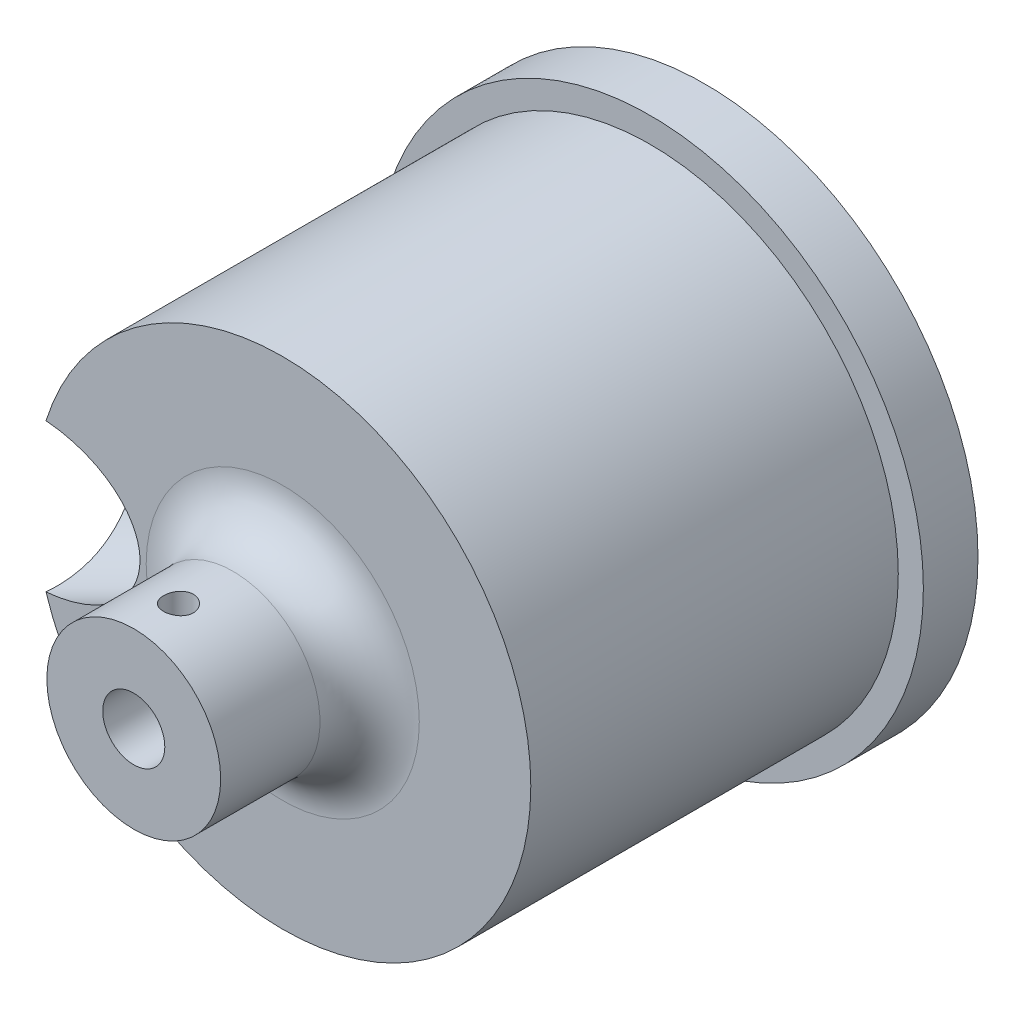
ISO-10303-21;
HEADER;
FILE_DESCRIPTION(('STEP AP214'),'2;1');
FILE_NAME('part.step','',(''),(''),'','','');
FILE_SCHEMA(('AUTOMOTIVE_DESIGN { 1 0 10303 214 1 1 1 1 }'));
ENDSEC;
DATA;
#1=APPLICATION_CONTEXT('core data for automotive mechanical design processes');
#2=APPLICATION_PROTOCOL_DEFINITION('international standard','automotive_design',2000,#1);
#3=PRODUCT_CONTEXT('',#1,'mechanical');
#4=PRODUCT('Part','Part','',(#3));
#5=PRODUCT_RELATED_PRODUCT_CATEGORY('part','',(#4));
#6=PRODUCT_DEFINITION_FORMATION('','',#4);
#7=PRODUCT_DEFINITION_CONTEXT('part definition',#1,'design');
#8=PRODUCT_DEFINITION('design','',#6,#7);
#9=PRODUCT_DEFINITION_SHAPE('','',#8);
#10=(LENGTH_UNIT() NAMED_UNIT(*) SI_UNIT(.MILLI.,.METRE.));
#11=(NAMED_UNIT(*) PLANE_ANGLE_UNIT() SI_UNIT($,.RADIAN.));
#12=(NAMED_UNIT(*) SI_UNIT($,.STERADIAN.) SOLID_ANGLE_UNIT());
#13=UNCERTAINTY_MEASURE_WITH_UNIT(LENGTH_MEASURE(1.E-05),#10,'distance_accuracy_value','');
#14=(GEOMETRIC_REPRESENTATION_CONTEXT(3) GLOBAL_UNCERTAINTY_ASSIGNED_CONTEXT((#13)) GLOBAL_UNIT_ASSIGNED_CONTEXT((#10,
#11,#12)) REPRESENTATION_CONTEXT('',''));
#15=CARTESIAN_POINT('',(0.,0.,0.));
#16=DIRECTION('',(0.,0.,1.));
#17=DIRECTION('',(1.,0.,0.));
#18=AXIS2_PLACEMENT_3D('',#15,#16,#17);
#19=CARTESIAN_POINT('',(0.,0.,25.));
#20=DIRECTION('',(0.,0.,1.));
#21=DIRECTION('',(1.,0.,0.));
#22=AXIS2_PLACEMENT_3D('',#19,#20,#21);
#23=CYLINDRICAL_SURFACE('',#22,24.975);
#24=CARTESIAN_POINT('',(0.,0.,-12.));
#25=DIRECTION('',(0.,0.,1.));
#26=DIRECTION('',(1.,0.,0.));
#27=AXIS2_PLACEMENT_3D('',#24,#25,#26);
#28=CIRCLE('',#27,24.975);
#29=CARTESIAN_POINT('',(24.975,0.,-12.));
#30=VERTEX_POINT('',#29);
#31=EDGE_CURVE('E123',#30,#30,#28,.T.);
#32=ORIENTED_EDGE('',*,*,#31,.T.);
#33=EDGE_LOOP('',(#32));
#34=FACE_BOUND('',#33,.T.);
#35=CARTESIAN_POINT('',(-23.8358983547869,7.45657928411341,25.));
#36=CARTESIAN_POINT('',(-23.8285639101941,7.47993592051796,24.6863459241653));
#37=CARTESIAN_POINT('',(-23.8241161903903,7.49411556448452,24.371855087137));
#38=CARTESIAN_POINT('',(-23.8213557793412,7.50293419891314,23.7422316009251));
#39=CARTESIAN_POINT('',(-23.8230500025732,7.49755116608571,23.4270986278052));
#40=CARTESIAN_POINT('',(-23.8329996120545,7.4658519739387,22.7949879497982));
#41=CARTESIAN_POINT('',(-23.8413163209704,7.43934016516037,22.4780206233164));
#42=CARTESIAN_POINT('',(-23.8648120391557,7.36362632386387,21.847140533864));
#43=CARTESIAN_POINT('',(-23.8799881932151,7.3144337319382,21.5332265554326));
#44=CARTESIAN_POINT('',(-23.9143887352912,7.2010801097362,20.9581903121674));
#45=CARTESIAN_POINT('',(-23.9326398160095,7.14035620245514,20.6963327074498));
#46=CARTESIAN_POINT('',(-23.9739576788844,7.00037986247415,20.1780130230676));
#47=CARTESIAN_POINT('',(-23.9970235507857,6.92113093166448,19.9215499336222));
#48=CARTESIAN_POINT('',(-24.0475809044411,6.74336623567378,19.4167361394446));
#49=CARTESIAN_POINT('',(-24.0750579517138,6.6449130929803,19.1683620498677));
#50=CARTESIAN_POINT('',(-24.1339582061038,6.42770183660886,18.6811328554532));
#51=CARTESIAN_POINT('',(-24.1653806365416,6.30894771767831,18.4422758892534));
#52=CARTESIAN_POINT('',(-24.2256249433421,6.07304043267515,18.017207342297));
#53=CARTESIAN_POINT('',(-24.253945712199,5.95921486276715,17.8290753654634));
#54=CARTESIAN_POINT('',(-24.3121456413984,5.71714033236125,17.4626036158131));
#55=CARTESIAN_POINT('',(-24.3420244747637,5.58889439165799,17.2842618044196));
#56=CARTESIAN_POINT('',(-24.4026473021022,5.31796002935831,16.9389099305144));
#57=CARTESIAN_POINT('',(-24.4333916636761,5.17526540232323,16.7719047887639));
#58=CARTESIAN_POINT('',(-24.4949081658501,4.87580298837125,16.4509960088916));
#59=CARTESIAN_POINT('',(-24.525680306823,4.71903500978308,16.2970925492631));
#60=CARTESIAN_POINT('',(-24.5865409451059,4.39097183736243,16.0030921377799));
#61=CARTESIAN_POINT('',(-24.6166235430746,4.21958705801949,15.8630936933448));
#62=CARTESIAN_POINT('',(-24.6749112742764,3.86416796985566,15.5997061886447));
#63=CARTESIAN_POINT('',(-24.7031163600608,3.68013334158497,15.4763175480642));
#64=CARTESIAN_POINT('',(-24.7566550893783,3.30080557692901,15.2477017748731));
#65=CARTESIAN_POINT('',(-24.7819899302333,3.10551718671868,15.1424670597105));
#66=CARTESIAN_POINT('',(-24.8288725175023,2.70523381480103,14.9514161784731));
#67=CARTESIAN_POINT('',(-24.8504207667142,2.50024012639561,14.8655974338366));
#68=CARTESIAN_POINT('',(-24.8866140731468,2.10741537402225,14.7234882034024));
#69=CARTESIAN_POINT('',(-24.9017764062389,1.92046180607324,14.6648943012555));
#70=CARTESIAN_POINT('',(-24.9280797353109,1.54189821500481,14.5641565951097));
#71=CARTESIAN_POINT('',(-24.9392210029606,1.3502885073957,14.5220116797747));
#72=CARTESIAN_POINT('',(-24.9571376570087,0.963991615634853,14.4545969817739));
#73=CARTESIAN_POINT('',(-24.9639145783132,0.769305538124754,14.4293212662305));
#74=CARTESIAN_POINT('',(-24.9728990279623,0.378364646440848,14.3958689950458));
#75=CARTESIAN_POINT('',(-24.9751066797569,0.182109874792935,14.3876919774418));
#76=CARTESIAN_POINT('',(-24.9748920757942,-0.198401907564117,14.3884892990043));
#77=CARTESIAN_POINT('',(-24.9727434722412,-0.382662041545914,14.3964498972913));
#78=CARTESIAN_POINT('',(-24.9644169839608,-0.749815583739789,14.4274489981027));
#79=CARTESIAN_POINT('',(-24.9582391957625,-0.93270902458826,14.4504871394068));
#80=CARTESIAN_POINT('',(-24.9420241681087,-1.29579186716461,14.5114369388456));
#81=CARTESIAN_POINT('',(-24.9319875782319,-1.47598171870466,14.5493460936621));
#82=CARTESIAN_POINT('',(-24.90832623208,-1.83243471363894,14.6397102905865));
#83=CARTESIAN_POINT('',(-24.8947014302312,-2.00869780712871,14.692165517444));
#84=CARTESIAN_POINT('',(-24.8642674571147,-2.35564812985435,14.8110096401886));
#85=CARTESIAN_POINT('',(-24.8474668209859,-2.52634889857689,14.8773612396466));
#86=CARTESIAN_POINT('',(-24.8110884487831,-2.86163667363689,15.0235362175563));
#87=CARTESIAN_POINT('',(-24.7915097848453,-3.02622161401121,15.103364098796));
#88=CARTESIAN_POINT('',(-24.7500780302153,-3.34822556638973,15.2757839515636));
#89=CARTESIAN_POINT('',(-24.7282252727208,-3.50564562334024,15.3683740538281));
#90=CARTESIAN_POINT('',(-24.682774952434,-3.81252059188369,15.5655572646166));
#91=CARTESIAN_POINT('',(-24.6591772460386,-3.96197484617389,15.6701513614186));
#92=CARTESIAN_POINT('',(-24.6096685435564,-4.25893637318294,15.8955853683931));
#93=CARTESIAN_POINT('',(-24.5837010301654,-4.40603334327311,16.0169531483653));
#94=CARTESIAN_POINT('',(-24.5310866221783,-4.69012704819304,16.2708413293745));
#95=CARTESIAN_POINT('',(-24.504439694426,-4.82712328882173,16.403362275427));
#96=CARTESIAN_POINT('',(-24.4510682092883,-5.09057532975486,16.6784566764885));
#97=CARTESIAN_POINT('',(-24.4243436552204,-5.21703157383801,16.8210297077949));
#98=CARTESIAN_POINT('',(-24.3713603066347,-5.45919317422267,17.1151714687879));
#99=CARTESIAN_POINT('',(-24.3451016741666,-5.57489484712435,17.2667432515989));
#100=CARTESIAN_POINT('',(-24.2907254663228,-5.80750281465228,17.5948201113112));
#101=CARTESIAN_POINT('',(-24.2627196613049,-5.9231507657677,17.7722369862976));
#102=CARTESIAN_POINT('',(-24.2084633953026,-6.14113176830489,18.1353557677134));
#103=CARTESIAN_POINT('',(-24.1822136451023,-6.24345944384757,18.3210609788479));
#104=CARTESIAN_POINT('',(-24.1068133997002,-6.53083329810495,18.8887324853685));
#105=CARTESIAN_POINT('',(-24.0610104636441,-6.69627626171184,19.2812632107549));
#106=CARTESIAN_POINT('',(-23.9903902216864,-6.94435209219805,19.9888821635995));
#107=CARTESIAN_POINT('',(-23.9631721757241,-7.03731907123234,20.300254122345));
#108=CARTESIAN_POINT('',(-23.9158398438599,-7.19653873585202,20.9304586114811));
#109=CARTESIAN_POINT('',(-23.8957291577586,-7.26277788648277,21.2492948355246));
#110=CARTESIAN_POINT('',(-23.8627603288276,-7.37037563179602,21.8918738388647));
#111=CARTESIAN_POINT('',(-23.8499121129571,-7.41170017619662,22.215622715893));
#112=CARTESIAN_POINT('',(-23.8313755661034,-7.47108535899488,22.8652993111449));
#113=CARTESIAN_POINT('',(-23.8256845119082,-7.48915484571742,23.1912261531974));
#114=CARTESIAN_POINT('',(-23.8216863249888,-7.5018609925442,23.7651653499253));
#115=CARTESIAN_POINT('',(-23.8219337105424,-7.5010843621143,24.0130844371245));
#116=CARTESIAN_POINT('',(-23.8261752232384,-7.48758522697046,24.5074934988594));
#117=CARTESIAN_POINT('',(-23.8301530961375,-7.47491454603172,24.753985008211));
#118=CARTESIAN_POINT('',(-23.8358983547869,-7.45657928411341,25.));
#119=B_SPLINE_CURVE_WITH_KNOTS('',3,(#35,#36,#37,#38,#39,#40,#41,#42,#43,#44,#45,#46,#47,#48,
#49,#50,#51,#52,#53,#54,#55,#56,#57,#58,#59,#60,#61,#62,#63,#64,#65,#66,#67,#68,#69,#70,#71,#72,
#73,#74,#75,#76,#77,#78,#79,#80,#81,#82,#83,#84,#85,#86,#87,#88,#89,#90,#91,#92,#93,#94,#95,#96,
#97,#98,#99,#100,#101,#102,#103,#104,#105,#106,#107,#108,#109,#110,#111,#112,#113,#114,#115,
#116,#117,#118),.UNSPECIFIED.,.F.,.F.,(4,2,2,2,2,2,2,2,2,2,2,2,2,2,2,2,2,2,2,2,2,2,2,2,2,2,2,2,
2,2,2,2,2,2,2,2,2,2,2,2,2,4),(0.,0.943803809705601,1.88867046476951,2.84238955327144,
3.79571202600659,4.60332218835892,5.41077980686455,6.21564714578679,7.02035628795754,
7.68482820730673,8.34916123668904,9.01378080463056,9.67840942569701,10.3474531375278,
11.0165137510985,11.6852942304824,12.3539858394517,12.9427463589016,13.5314670932796,
14.1199806660084,14.7084783384084,15.2611528852577,15.8138141918878,16.3663825059424,
16.9189578384865,17.470068697116,18.0213640624802,18.5725787660748,19.1238388832717,
19.7006144436607,20.2774182053993,20.8541976689645,21.4311739549742,22.0713998107501,
22.711883256981,23.9928188571407,24.9699124903306,25.947500303983,26.9264211560037,
27.9049694278673,28.6484251411223,29.3886564925264),.UNSPECIFIED.);
#120=CARTESIAN_POINT('',(-23.8358983547869,7.45657928411342,25.));
#121=VERTEX_POINT('',#120);
#122=CARTESIAN_POINT('',(-23.8358983547869,-7.45657928411341,25.));
#123=VERTEX_POINT('',#122);
#124=EDGE_CURVE('E113',#121,#123,#119,.T.);
#125=ORIENTED_EDGE('',*,*,#124,.F.);
#126=CARTESIAN_POINT('',(0.,0.,25.));
#127=DIRECTION('',(0.,0.,1.));
#128=DIRECTION('',(1.,0.,0.));
#129=AXIS2_PLACEMENT_3D('',#126,#127,#128);
#130=CIRCLE('',#129,24.975);
#131=EDGE_CURVE('E125',#123,#121,#130,.T.);
#132=ORIENTED_EDGE('',*,*,#131,.F.);
#133=EDGE_LOOP('',(#125,#132));
#134=FACE_BOUND('',#133,.T.);
#135=ADVANCED_FACE('F41',(#34,#134),#23,.T.);
#136=CARTESIAN_POINT('',(-24.975,0.,25.));
#137=DIRECTION('',(0.,0.,-1.));
#138=DIRECTION('',(-1.,0.,0.));
#139=AXIS2_PLACEMENT_3D('',#136,#137,#138);
#140=PLANE('',#139);
#141=CARTESIAN_POINT('',(0.,0.,25.));
#142=DIRECTION('',(0.,0.,-1.));
#143=DIRECTION('',(-1.,0.,0.));
#144=AXIS2_PLACEMENT_3D('',#141,#142,#143);
#145=CIRCLE('',#144,13.75);
#146=CARTESIAN_POINT('',(-13.75,0.,25.));
#147=VERTEX_POINT('',#146);
#148=EDGE_CURVE('E49',#147,#147,#145,.T.);
#149=ORIENTED_EDGE('',*,*,#148,.T.);
#150=EDGE_LOOP('',(#149));
#151=FACE_BOUND('',#150,.T.);
#152=ORIENTED_EDGE('',*,*,#131,.T.);
#153=CARTESIAN_POINT('',(-24.975,0.,25.));
#154=DIRECTION('',(0.,0.,-1.));
#155=DIRECTION('',(-1.,0.,0.));
#156=AXIS2_PLACEMENT_3D('',#153,#154,#155);
#157=ELLIPSE('',#156,10.6012997434277,7.5);
#158=EDGE_CURVE('E57',#121,#123,#157,.T.);
#159=ORIENTED_EDGE('',*,*,#158,.T.);
#160=EDGE_LOOP('',(#152,#159));
#161=FACE_BOUND('',#160,.T.);
#162=ADVANCED_FACE('F122',(#151,#161),#140,.F.);
#163=CARTESIAN_POINT('',(0.,0.,45.));
#164=DIRECTION('',(0.,0.,-1.));
#165=DIRECTION('',(-1.,0.,0.));
#166=AXIS2_PLACEMENT_3D('',#163,#164,#165);
#167=CYLINDRICAL_SURFACE('',#166,8.75);
#168=CARTESIAN_POINT('',(0.,8.75,34.));
#169=CARTESIAN_POINT('',(-0.0835989442386164,8.74999854533168,34.0000033199861));
#170=CARTESIAN_POINT('',(-0.167242629071561,8.74878946707916,34.0070123945573));
#171=CARTESIAN_POINT('',(-0.332181627885485,8.74408266539355,34.0348504502178));
#172=CARTESIAN_POINT('',(-0.413474751921135,8.74058287523621,34.0556919113898));
#173=CARTESIAN_POINT('',(-0.571302645066654,8.73168696812766,34.1105449569762));
#174=CARTESIAN_POINT('',(-0.647841333712987,8.72629243827974,34.1445455212658));
#175=CARTESIAN_POINT('',(-0.794118368623576,8.71419930408208,34.2247222201168));
#176=CARTESIAN_POINT('',(-0.863857441399455,8.70750083928223,34.2708970519495));
#177=CARTESIAN_POINT('',(-0.995268439907604,8.69346612902714,34.3746069264191));
#178=CARTESIAN_POINT('',(-1.0568618079566,8.68612466923957,34.4322408145647));
#179=CARTESIAN_POINT('',(-1.16955417441213,8.67167103987754,34.5570200493148));
#180=CARTESIAN_POINT('',(-1.22065249123587,8.66455888522017,34.6241660131862));
#181=CARTESIAN_POINT('',(-1.31122171713836,8.65131860287636,34.7666064446881));
#182=CARTESIAN_POINT('',(-1.35061445216314,8.6451972101288,34.8419512992188));
#183=CARTESIAN_POINT('',(-1.41615427557975,8.63470414423137,34.9983113135358));
#184=CARTESIAN_POINT('',(-1.44230231211954,8.63033234583804,35.0793260669586));
#185=CARTESIAN_POINT('',(-1.48036195780661,8.62388550159562,35.2438916582515));
#186=CARTESIAN_POINT('',(-1.49240950237182,8.62178853987851,35.3274101829207));
#187=CARTESIAN_POINT('',(-1.50234775058279,8.62006255030295,35.4953075674591));
#188=CARTESIAN_POINT('',(-1.50023951416803,8.62043333766735,35.5796863624417));
#189=CARTESIAN_POINT('',(-1.48203665985519,8.62358095436352,35.7459355699223));
#190=CARTESIAN_POINT('',(-1.46609515128517,8.62633144371434,35.8278233180893));
#191=CARTESIAN_POINT('',(-1.42091873893297,8.63388729213218,35.987744458214));
#192=CARTESIAN_POINT('',(-1.39168335518909,8.63869272539048,36.0657777108965));
#193=CARTESIAN_POINT('',(-1.32059505534932,8.64984526339615,36.2162308716234));
#194=CARTESIAN_POINT('',(-1.27867894551892,8.65620005778534,36.2886203275124));
#195=CARTESIAN_POINT('',(-1.18346386577856,8.66973001190969,36.4253962351229));
#196=CARTESIAN_POINT('',(-1.13016392519266,8.67690524157741,36.4897820036452));
#197=CARTESIAN_POINT('',(-1.01286186149799,8.6913831271253,36.6096087779754));
#198=CARTESIAN_POINT('',(-0.948728459636025,8.69868621946603,36.664921298771));
#199=CARTESIAN_POINT('',(-0.812022942479687,8.71251002037548,36.7640197256158));
#200=CARTESIAN_POINT('',(-0.739450766808481,8.71903072334576,36.8078055491879));
#201=CARTESIAN_POINT('',(-0.587804067019338,8.73056510572575,36.8826209245452));
#202=CARTESIAN_POINT('',(-0.508723613881951,8.73557739117882,36.9136386868029));
#203=CARTESIAN_POINT('',(-0.346370422397847,8.74351910124272,36.9619159013384));
#204=CARTESIAN_POINT('',(-0.263098056044994,8.7464487103243,36.9791765721519));
#205=CARTESIAN_POINT('',(-0.0958318104733762,8.74987005836954,36.9992744424493));
#206=CARTESIAN_POINT('',(-0.0118597040843769,8.75039159522844,37.0022879499979));
#207=CARTESIAN_POINT('',(0.155389295281614,8.7490198022012,36.9942766257273));
#208=CARTESIAN_POINT('',(0.238666216475369,8.74712657081211,36.9832523665009));
#209=CARTESIAN_POINT('',(0.401613133905656,8.74115643713808,36.9476250839372));
#210=CARTESIAN_POINT('',(0.481302868720163,8.73709364466652,36.923109769029));
#211=CARTESIAN_POINT('',(0.635441265489672,8.72723807861037,36.8612900835129));
#212=CARTESIAN_POINT('',(0.709889618818364,8.72144520325905,36.8239849605654));
#213=CARTESIAN_POINT('',(0.85219484645228,8.70869801707149,36.7372437915629));
#214=CARTESIAN_POINT('',(0.919983968910232,8.70173340431864,36.6876981371588));
#215=CARTESIAN_POINT('',(1.04634876320204,8.68744528791298,36.5780325588378));
#216=CARTESIAN_POINT('',(1.10492372382458,8.68012175661356,36.5179118194222));
#217=CARTESIAN_POINT('',(1.21185461459522,8.66584430603362,36.3880102557164));
#218=CARTESIAN_POINT('',(1.26009115203268,8.65889533382755,36.3181305206007));
#219=CARTESIAN_POINT('',(1.34414088597865,8.64624770224082,36.171156386697));
#220=CARTESIAN_POINT('',(1.37995449248233,8.64054900159961,36.0940622261139));
#221=CARTESIAN_POINT('',(1.43796519533105,8.6310846384818,35.9351747598522));
#222=CARTESIAN_POINT('',(1.4602206875589,8.62731069752545,35.8534032904109));
#223=CARTESIAN_POINT('',(1.49066643655289,8.62210277652897,35.6872122670962));
#224=CARTESIAN_POINT('',(1.49885799429605,8.62066858005259,35.6027929588954));
#225=CARTESIAN_POINT('',(1.50090546278888,8.62031222810043,35.4348955943054));
#226=CARTESIAN_POINT('',(1.49494938196749,8.62135712762261,35.3514198413397));
#227=CARTESIAN_POINT('',(1.46927829070829,8.62576884510981,35.1866772418621));
#228=CARTESIAN_POINT('',(1.44956333247983,8.62913565426412,35.1054103869697));
#229=CARTESIAN_POINT('',(1.39700777718865,8.63779901677269,34.9474713907458));
#230=CARTESIAN_POINT('',(1.36418428469469,8.64309305460445,34.870793410993));
#231=CARTESIAN_POINT('',(1.28636295869389,8.65501664902595,34.7240022228427));
#232=CARTESIAN_POINT('',(1.2413644642831,8.66164627811152,34.6538893711027));
#233=CARTESIAN_POINT('',(1.13980326427207,8.67559803791655,34.5212705448671));
#234=CARTESIAN_POINT('',(1.08310255631921,8.68292781327498,34.4588710427187));
#235=CARTESIAN_POINT('',(0.960036856193801,8.69739385628585,34.3444083694159));
#236=CARTESIAN_POINT('',(0.893669640127244,8.70453007895987,34.2923475833366));
#237=CARTESIAN_POINT('',(0.752573839186562,8.71786592759124,34.1996885389346));
#238=CARTESIAN_POINT('',(0.677787383299676,8.72405828400737,34.1591773431));
#239=CARTESIAN_POINT('',(0.522393433887055,8.73473795330271,34.0913561581987));
#240=CARTESIAN_POINT('',(0.441791756510339,8.73922694244046,34.0640331835557));
#241=CARTESIAN_POINT('',(0.300743965339884,8.74502844510869,34.0292115664517));
#242=CARTESIAN_POINT('',(0.241145248405084,8.74688269150056,34.0182750255541));
#243=CARTESIAN_POINT('',(0.121038828280111,8.74936898406435,34.0036681088703));
#244=CARTESIAN_POINT('',(0.060531142246696,8.75000105327569,33.9999975961114));
#245=CARTESIAN_POINT('',(0.,8.75,34.));
#246=B_SPLINE_CURVE_WITH_KNOTS('',3,(#168,#169,#170,#171,#172,#173,#174,#175,#176,#177,#178,
#179,#180,#181,#182,#183,#184,#185,#186,#187,#188,#189,#190,#191,#192,#193,#194,#195,#196,#197,
#198,#199,#200,#201,#202,#203,#204,#205,#206,#207,#208,#209,#210,#211,#212,#213,#214,#215,#216,
#217,#218,#219,#220,#221,#222,#223,#224,#225,#226,#227,#228,#229,#230,#231,#232,#233,#234,#235,
#236,#237,#238,#239,#240,#241,#242,#243,#244,#245),.UNSPECIFIED.,.T.,.F.,(4,2,2,2,2,2,2,2,2,2,2,
2,2,2,2,2,2,2,2,2,2,2,2,2,2,2,2,2,2,2,2,2,2,2,2,2,2,2,4),(0.,0.250575550878601,
0.501377488035612,0.751969843365163,1.00253539450022,1.25536421770615,1.50820945525042,
1.76270717478227,2.01718667301529,2.26919211577891,2.52117868939364,2.77041129544868,
3.01965290050546,3.27015764139126,3.52068375083729,3.77449786345848,4.02831379215347,
4.28236356164807,4.53639082616131,4.78726613745983,5.0381312160195,5.28738430760508,
5.53665206361356,5.78823838646018,6.03984411892217,6.29421523620441,6.54857795765346,
6.80183722664438,7.0550730667544,7.30496251367268,7.5548510123671,7.80441450581765,
8.05399154921283,8.30669980095774,8.5594662833132,8.81409060872387,9.06846370822282,
9.24990033265443,9.43133353676861),.UNSPECIFIED.);
#247=CARTESIAN_POINT('',(0.,8.75,34.));
#248=VERTEX_POINT('',#247);
#249=EDGE_CURVE('E245',#248,#248,#246,.T.);
#250=ORIENTED_EDGE('',*,*,#249,.F.);
#251=EDGE_LOOP('',(#250));
#252=FACE_BOUND('',#251,.T.);
#253=CARTESIAN_POINT('',(0.,0.,30.));
#254=DIRECTION('',(0.,0.,-1.));
#255=DIRECTION('',(-1.,0.,0.));
#256=AXIS2_PLACEMENT_3D('',#253,#254,#255);
#257=CIRCLE('',#256,8.75);
#258=CARTESIAN_POINT('',(-8.75,0.,30.));
#259=VERTEX_POINT('',#258);
#260=EDGE_CURVE('E140',#259,#259,#257,.F.);
#261=ORIENTED_EDGE('',*,*,#260,.T.);
#262=EDGE_LOOP('',(#261));
#263=FACE_BOUND('',#262,.T.);
#264=CARTESIAN_POINT('',(0.,0.,40.));
#265=DIRECTION('',(0.,0.,1.));
#266=DIRECTION('',(1.,0.,0.));
#267=AXIS2_PLACEMENT_3D('',#264,#265,#266);
#268=CIRCLE('',#267,8.75);
#269=CARTESIAN_POINT('',(8.75,0.,40.));
#270=VERTEX_POINT('',#269);
#271=EDGE_CURVE('E307',#270,#270,#268,.T.);
#272=ORIENTED_EDGE('',*,*,#271,.F.);
#273=EDGE_LOOP('',(#272));
#274=FACE_BOUND('',#273,.T.);
#275=ADVANCED_FACE('F236',(#252,#263,#274),#167,.T.);
#276=CARTESIAN_POINT('',(0.,0.,25.));
#277=DIRECTION('',(0.,0.,1.));
#278=DIRECTION('',(1.,0.,0.));
#279=AXIS2_PLACEMENT_3D('',#276,#277,#278);
#280=CYLINDRICAL_SURFACE('',#279,3.125);
#281=DIRECTION('',(0.,0.,1.));
#282=VECTOR('',#281,1.);
#283=CARTESIAN_POINT('',(-2.29128784747792,2.125,25.));
#284=LINE('',#283,#282);
#285=CARTESIAN_POINT('',(-2.29128784747792,2.125,25.));
#286=VERTEX_POINT('',#285);
#287=CARTESIAN_POINT('',(-2.29128784747792,2.125,34.));
#288=VERTEX_POINT('',#287);
#289=EDGE_CURVE('E259',#286,#288,#284,.T.);
#290=ORIENTED_EDGE('',*,*,#289,.T.);
#291=CARTESIAN_POINT('',(0.,0.,34.));
#292=DIRECTION('',(0.,0.,1.));
#293=DIRECTION('',(1.,0.,0.));
#294=AXIS2_PLACEMENT_3D('',#291,#292,#293);
#295=CIRCLE('',#294,3.125);
#296=CARTESIAN_POINT('',(0.,3.125,34.));
#297=VERTEX_POINT('',#296);
#298=EDGE_CURVE('E315',#297,#288,#295,.T.);
#299=ORIENTED_EDGE('',*,*,#298,.F.);
#300=CARTESIAN_POINT('',(0.,3.125,34.));
#301=CARTESIAN_POINT('',(-0.0792312177724547,3.12499605482364,34.0000046331101));
#302=CARTESIAN_POINT('',(-0.158567963515739,3.12195390140571,34.0063145545309));
#303=CARTESIAN_POINT('',(-0.31492012749851,3.11008502159317,34.0312862293662));
#304=CARTESIAN_POINT('',(-0.391930332381226,3.10124618559722,34.0499738412992));
#305=CARTESIAN_POINT('',(-0.54112481218409,3.07871402233487,34.0988144528626));
#306=CARTESIAN_POINT('',(-0.613326125402104,3.06503905152783,34.1289241288796));
#307=CARTESIAN_POINT('',(-0.751556696995108,3.03410801011345,34.1995416902551));
#308=CARTESIAN_POINT('',(-0.817586766977156,3.016852411374,34.2400482056476));
#309=CARTESIAN_POINT('',(-0.945840010949784,2.97921628330885,34.3329484329032));
#310=CARTESIAN_POINT('',(-1.00763116949321,2.9587136463026,34.3858884238459));
#311=CARTESIAN_POINT('',(-1.12185004605684,2.917323263289,34.5009836195773));
#312=CARTESIAN_POINT('',(-1.17427122433947,2.89643525944738,34.5631452055931));
#313=CARTESIAN_POINT('',(-1.27192900776573,2.85496609761777,34.7001520785148));
#314=CARTESIAN_POINT('',(-1.31640595538627,2.83450874194446,34.7755805980662));
#315=CARTESIAN_POINT('',(-1.39185510991111,2.79823676848201,34.9339458380856));
#316=CARTESIAN_POINT('',(-1.42283636543305,2.78241904223665,35.0168774826496));
#317=CARTESIAN_POINT('',(-1.46849822643714,2.75858136864291,35.1829907216717));
#318=CARTESIAN_POINT('',(-1.48401475025483,2.7501648475589,35.2658829339662));
#319=CARTESIAN_POINT('',(-1.50088417031184,2.74099881924434,35.4334869655053));
#320=CARTESIAN_POINT('',(-1.5022491970227,2.74024274559469,35.5181971639618));
#321=CARTESIAN_POINT('',(-1.49139336748576,2.74615935325496,35.6772106635146));
#322=CARTESIAN_POINT('',(-1.48062448757147,2.75203820750794,35.7516494799366));
#323=CARTESIAN_POINT('',(-1.44830178087746,2.7691836615128,35.8974968173248));
#324=CARTESIAN_POINT('',(-1.42674494015443,2.78045176687607,35.9689044853966));
#325=CARTESIAN_POINT('',(-1.37304444984551,2.80736350684485,36.1086773157796));
#326=CARTESIAN_POINT('',(-1.34066618596552,2.82310283114258,36.1769330573159));
#327=CARTESIAN_POINT('',(-1.26641680117508,2.85718046252803,36.3073574476053));
#328=CARTESIAN_POINT('',(-1.22454146783932,2.87551992154833,36.3695233776484));
#329=CARTESIAN_POINT('',(-1.12683013997761,2.91529898886493,36.4935723465814));
#330=CARTESIAN_POINT('',(-1.06993969866439,2.93685184708219,36.5545912880912));
#331=CARTESIAN_POINT('',(-0.946607776036855,2.97889293142376,36.6665652313837));
#332=CARTESIAN_POINT('',(-0.880162413459253,2.9993807202839,36.7175161234027));
#333=CARTESIAN_POINT('',(-0.736240155116152,3.03798215287827,36.8097854639272));
#334=CARTESIAN_POINT('',(-0.658430101776786,3.05596930139281,36.850641368553));
#335=CARTESIAN_POINT('',(-0.495957150592577,3.08649682405619,36.9183638846422));
#336=CARTESIAN_POINT('',(-0.411299338751909,3.09904119741281,36.9452407704163));
#337=CARTESIAN_POINT('',(-0.244647664500988,3.11644587142307,36.9821781603445));
#338=CARTESIAN_POINT('',(-0.162964352730084,3.12183098626084,36.993390739024));
#339=CARTESIAN_POINT('',(0.00129048144321903,3.1260775892683,37.0022496875866));
#340=CARTESIAN_POINT('',(0.0838616159204355,3.12494181959825,36.9999017599269));
#341=CARTESIAN_POINT('',(0.241404145356361,3.11659109608137,36.9824185162992));
#342=CARTESIAN_POINT('',(0.316502354087392,3.10980814473038,36.9681917027336));
#343=CARTESIAN_POINT('',(0.463111892799535,3.09137735702222,36.9287379868861));
#344=CARTESIAN_POINT('',(0.534622811764361,3.07972896462319,36.9035098273123));
#345=CARTESIAN_POINT('',(0.674492251763247,3.05219939893068,36.8420403971348));
#346=CARTESIAN_POINT('',(0.742691787172958,3.03620170019408,36.8054913698104));
#347=CARTESIAN_POINT('',(0.872226488208805,3.00155773275974,36.7227568318326));
#348=CARTESIAN_POINT('',(0.933558636984629,2.98291030813318,36.6765671113332));
#349=CARTESIAN_POINT('',(1.05359224770104,2.94277634105609,36.57093833876));
#350=CARTESIAN_POINT('',(1.11153186995994,2.92118646143844,36.5106710587832));
#351=CARTESIAN_POINT('',(1.21678760972325,2.87893667693217,36.3811345351131));
#352=CARTESIAN_POINT('',(1.26409778444433,2.85827729740857,36.3118602897411));
#353=CARTESIAN_POINT('',(1.34842009662906,2.81950869810975,36.1628465752752));
#354=CARTESIAN_POINT('',(1.38496619465495,2.80152811537215,36.0828070832574));
#355=CARTESIAN_POINT('',(1.44368289731006,2.77173343160626,35.9165649002992));
#356=CARTESIAN_POINT('',(1.46587049335228,2.75991204521492,35.8303696285985));
#357=CARTESIAN_POINT('',(1.4933184326625,2.7451495321269,35.6628532901439));
#358=CARTESIAN_POINT('',(1.49995930401441,2.74148572709401,35.5818228531202));
#359=CARTESIAN_POINT('',(1.50004027600001,2.74144255237943,35.4197658672886));
#360=CARTESIAN_POINT('',(1.49348477483014,2.74506075568955,35.3387393261831));
#361=CARTESIAN_POINT('',(1.46862255362863,2.75843121404856,35.1859066558402));
#362=CARTESIAN_POINT('',(1.45131545682783,2.76766037332725,35.113886751479));
#363=CARTESIAN_POINT('',(1.40660825934151,2.79064620610343,34.9738238018053));
#364=CARTESIAN_POINT('',(1.37920507676009,2.80440426193931,34.9057819781843));
#365=CARTESIAN_POINT('',(1.31300895737697,2.83602910363513,34.7705837497099));
#366=CARTESIAN_POINT('',(1.27357600073123,2.85410939077801,34.7037920029431));
#367=CARTESIAN_POINT('',(1.18519019246661,2.89193001093259,34.5773511640091));
#368=CARTESIAN_POINT('',(1.1362326600494,2.91167115744573,34.5177056071798));
#369=CARTESIAN_POINT('',(1.02393711757697,2.95315649514112,34.4005317258706));
#370=CARTESIAN_POINT('',(0.959614948286292,2.9748854866065,34.343936157203));
#371=CARTESIAN_POINT('',(0.821713996128215,3.01588801898818,34.2421733753876));
#372=CARTESIAN_POINT('',(0.748130651099171,3.03516034023743,34.1970118280193));
#373=CARTESIAN_POINT('',(0.593505134508089,3.06914252134748,34.1197040975685));
#374=CARTESIAN_POINT('',(0.512469766037501,3.08385649003035,34.0875461851988));
#375=CARTESIAN_POINT('',(0.345346769438463,3.1069957188951,34.0377101725492));
#376=CARTESIAN_POINT('',(0.259274724437327,3.1154393732801,34.0199897045089));
#377=CARTESIAN_POINT('',(0.143695076854854,3.12182739334034,34.0066196590053));
#378=CARTESIAN_POINT('',(0.115029780348248,3.12301447886228,34.0041402766943));
#379=CARTESIAN_POINT('',(0.0575809713523489,3.12460150872779,34.0008295851628));
#380=CARTESIAN_POINT('',(0.0287974560035576,3.12500143391766,33.9999983160453));
#381=CARTESIAN_POINT('',(0.,3.125,34.));
#382=B_SPLINE_CURVE_WITH_KNOTS('',3,(#300,#301,#302,#303,#304,#305,#306,#307,#308,#309,#310,
#311,#312,#313,#314,#315,#316,#317,#318,#319,#320,#321,#322,#323,#324,#325,#326,#327,#328,#329,
#330,#331,#332,#333,#334,#335,#336,#337,#338,#339,#340,#341,#342,#343,#344,#345,#346,#347,#348,
#349,#350,#351,#352,#353,#354,#355,#356,#357,#358,#359,#360,#361,#362,#363,#364,#365,#366,#367,
#368,#369,#370,#371,#372,#373,#374,#375,#376,#377,#378,#379,#380,#381),.UNSPECIFIED.,.T.,.F.,(4,
2,2,2,2,2,2,2,2,2,2,2,2,2,2,2,2,2,2,2,2,2,2,2,2,2,2,2,2,2,2,2,2,2,2,2,2,2,2,2,4),(0.,
0.237576314075981,0.475650526414477,0.712830614453303,0.949979465883872,1.20065606575378,
1.45150694686929,1.71991520692495,1.98814322605369,2.24092575087175,2.49349157600143,
2.71876846000302,2.94410831708472,3.17469023678047,3.4053746318097,3.66273636367563,
3.92020293420428,4.18788777790972,4.45537559937599,4.70191634339298,4.9483534197712,
5.17750457152269,5.406681918743,5.64273624463582,5.87889386593487,6.13678988519695,
6.3948297338844,6.66279374068246,6.93044006437642,7.17323303093189,7.41594509083222,
7.63890725243085,7.86193753114791,8.09990850357083,8.33799672224738,8.60193132171794,
8.86599645105823,9.12982285930327,9.39287223193909,9.47921985067518,9.56556957045025),.UNSPECIFIED.);
#383=EDGE_CURVE('E12',#297,#297,#382,.T.);
#384=ORIENTED_EDGE('',*,*,#383,.T.);
#385=CARTESIAN_POINT('',(2.29128784747792,2.125,34.));
#386=VERTEX_POINT('',#385);
#387=EDGE_CURVE('E311',#386,#297,#295,.T.);
#388=ORIENTED_EDGE('',*,*,#387,.F.);
#389=DIRECTION('',(0.,0.,1.));
#390=VECTOR('',#389,1.);
#391=CARTESIAN_POINT('',(2.29128784747792,2.125,25.));
#392=LINE('',#391,#390);
#393=CARTESIAN_POINT('',(2.29128784747792,2.125,25.));
#394=VERTEX_POINT('',#393);
#395=EDGE_CURVE('E258',#394,#386,#392,.T.);
#396=ORIENTED_EDGE('',*,*,#395,.F.);
#397=CARTESIAN_POINT('',(0.,0.,25.));
#398=DIRECTION('',(0.,0.,1.));
#399=DIRECTION('',(1.,0.,0.));
#400=AXIS2_PLACEMENT_3D('',#397,#398,#399);
#401=CIRCLE('',#400,3.125);
#402=EDGE_CURVE('E254',#286,#394,#401,.T.);
#403=ORIENTED_EDGE('',*,*,#402,.F.);
#404=EDGE_LOOP('',(#290,#299,#384,#388,#396,#403));
#405=FACE_BOUND('',#404,.T.);
#406=CARTESIAN_POINT('',(0.,0.,40.));
#407=DIRECTION('',(0.,0.,1.));
#408=DIRECTION('',(1.,0.,0.));
#409=AXIS2_PLACEMENT_3D('',#406,#407,#408);
#410=CIRCLE('',#409,3.125);
#411=CARTESIAN_POINT('',(3.125,0.,40.));
#412=VERTEX_POINT('',#411);
#413=EDGE_CURVE('E44',#412,#412,#410,.F.);
#414=ORIENTED_EDGE('',*,*,#413,.F.);
#415=EDGE_LOOP('',(#414));
#416=FACE_BOUND('',#415,.T.);
#417=ADVANCED_FACE('F196',(#405,#416),#280,.F.);
#418=CARTESIAN_POINT('',(-2.29128784747792,2.125,25.));
#419=DIRECTION('',(0.,-1.,0.));
#420=DIRECTION('',(0.,0.,-1.));
#421=AXIS2_PLACEMENT_3D('',#418,#419,#420);
#422=PLANE('',#421);
#423=ORIENTED_EDGE('',*,*,#395,.T.);
#424=DIRECTION('',(-1.,0.,0.));
#425=VECTOR('',#424,1.);
#426=CARTESIAN_POINT('',(-2.29128784747792,2.125,34.));
#427=LINE('',#426,#425);
#428=EDGE_CURVE('E249',#386,#288,#427,.T.);
#429=ORIENTED_EDGE('',*,*,#428,.T.);
#430=ORIENTED_EDGE('',*,*,#289,.F.);
#431=DIRECTION('',(1.,0.,0.));
#432=VECTOR('',#431,1.);
#433=CARTESIAN_POINT('',(-2.29128784747792,2.125,25.));
#434=LINE('',#433,#432);
#435=EDGE_CURVE('E248',#286,#394,#434,.T.);
#436=ORIENTED_EDGE('',*,*,#435,.T.);
#437=EDGE_LOOP('',(#423,#429,#430,#436));
#438=FACE_BOUND('',#437,.T.);
#439=ADVANCED_FACE('F195',(#438),#422,.T.);
#440=CARTESIAN_POINT('',(0.,0.,25.));
#441=DIRECTION('',(0.,0.,1.));
#442=DIRECTION('',(1.,0.,0.));
#443=AXIS2_PLACEMENT_3D('',#440,#441,#442);
#444=CYLINDRICAL_SURFACE('',#443,27.5);
#445=CARTESIAN_POINT('',(0.,0.,-12.));
#446=DIRECTION('',(0.,0.,1.));
#447=DIRECTION('',(1.,0.,0.));
#448=AXIS2_PLACEMENT_3D('',#445,#446,#447);
#449=CIRCLE('',#448,27.5);
#450=CARTESIAN_POINT('',(27.5,0.,-12.));
#451=VERTEX_POINT('',#450);
#452=EDGE_CURVE('E128',#451,#451,#449,.T.);
#453=ORIENTED_EDGE('',*,*,#452,.F.);
#454=EDGE_LOOP('',(#453));
#455=FACE_BOUND('',#454,.T.);
#456=CARTESIAN_POINT('',(0.,0.,-17.5));
#457=DIRECTION('',(0.,0.,-1.));
#458=DIRECTION('',(-1.,0.,0.));
#459=AXIS2_PLACEMENT_3D('',#456,#457,#458);
#460=CIRCLE('',#459,27.5);
#461=CARTESIAN_POINT('',(-27.5,0.,-17.5));
#462=VERTEX_POINT('',#461);
#463=EDGE_CURVE('E129',#462,#462,#460,.T.);
#464=ORIENTED_EDGE('',*,*,#463,.F.);
#465=EDGE_LOOP('',(#464));
#466=FACE_BOUND('',#465,.T.);
#467=ADVANCED_FACE('F188',(#455,#466),#444,.T.);
#468=CARTESIAN_POINT('',(-27.5,0.,-12.));
#469=DIRECTION('',(0.,0.,-1.));
#470=DIRECTION('',(-1.,0.,0.));
#471=AXIS2_PLACEMENT_3D('',#468,#469,#470);
#472=PLANE('',#471);
#473=ORIENTED_EDGE('',*,*,#31,.F.);
#474=EDGE_LOOP('',(#473));
#475=FACE_BOUND('',#474,.T.);
#476=ORIENTED_EDGE('',*,*,#452,.T.);
#477=EDGE_LOOP('',(#476));
#478=FACE_BOUND('',#477,.T.);
#479=ADVANCED_FACE('F190',(#475,#478),#472,.F.);
#480=CARTESIAN_POINT('',(0.,0.,-17.5));
#481=DIRECTION('',(0.,0.,-1.));
#482=DIRECTION('',(-1.,0.,0.));
#483=AXIS2_PLACEMENT_3D('',#480,#481,#482);
#484=PLANE('',#483);
#485=DIRECTION('',(-1.,0.,0.));
#486=VECTOR('',#485,1.);
#487=CARTESIAN_POINT('',(7.50000000000001,-12.9903810567666,-17.5));
#488=LINE('',#487,#486);
#489=CARTESIAN_POINT('',(7.50000000000001,-12.9903810567666,-17.5));
#490=VERTEX_POINT('',#489);
#491=CARTESIAN_POINT('',(-7.50000000000001,-12.9903810567666,-17.5));
#492=VERTEX_POINT('',#491);
#493=EDGE_CURVE('E276',#490,#492,#488,.T.);
#494=ORIENTED_EDGE('',*,*,#493,.F.);
#495=DIRECTION('',(-0.5,-0.866025403784439,0.));
#496=VECTOR('',#495,1.);
#497=CARTESIAN_POINT('',(15.,0.,-17.5));
#498=LINE('',#497,#496);
#499=CARTESIAN_POINT('',(15.,0.,-17.5));
#500=VERTEX_POINT('',#499);
#501=EDGE_CURVE('E274',#500,#490,#498,.T.);
#502=ORIENTED_EDGE('',*,*,#501,.F.);
#503=DIRECTION('',(0.5,-0.866025403784439,0.));
#504=VECTOR('',#503,1.);
#505=CARTESIAN_POINT('',(7.5,12.9903810567666,-17.5));
#506=LINE('',#505,#504);
#507=CARTESIAN_POINT('',(7.5,12.9903810567666,-17.5));
#508=VERTEX_POINT('',#507);
#509=EDGE_CURVE('E272',#508,#500,#506,.T.);
#510=ORIENTED_EDGE('',*,*,#509,.F.);
#511=DIRECTION('',(1.,0.,0.));
#512=VECTOR('',#511,1.);
#513=CARTESIAN_POINT('',(-7.5,12.9903810567666,-17.5));
#514=LINE('',#513,#512);
#515=CARTESIAN_POINT('',(-7.5,12.9903810567666,-17.5));
#516=VERTEX_POINT('',#515);
#517=EDGE_CURVE('E267',#516,#508,#514,.T.);
#518=ORIENTED_EDGE('',*,*,#517,.F.);
#519=DIRECTION('',(0.5,0.866025403784439,0.));
#520=VECTOR('',#519,1.);
#521=CARTESIAN_POINT('',(-15.,0.,-17.5));
#522=LINE('',#521,#520);
#523=CARTESIAN_POINT('',(-15.,0.,-17.5));
#524=VERTEX_POINT('',#523);
#525=EDGE_CURVE('E263',#524,#516,#522,.T.);
#526=ORIENTED_EDGE('',*,*,#525,.F.);
#527=DIRECTION('',(-0.5,0.866025403784439,0.));
#528=VECTOR('',#527,1.);
#529=CARTESIAN_POINT('',(-7.50000000000001,-12.9903810567666,-17.5));
#530=LINE('',#529,#528);
#531=EDGE_CURVE('E264',#492,#524,#530,.T.);
#532=ORIENTED_EDGE('',*,*,#531,.F.);
#533=EDGE_LOOP('',(#494,#502,#510,#518,#526,#532));
#534=FACE_BOUND('',#533,.T.);
#535=ORIENTED_EDGE('',*,*,#463,.T.);
#536=EDGE_LOOP('',(#535));
#537=FACE_BOUND('',#536,.T.);
#538=ADVANCED_FACE('F186',(#534,#537),#484,.T.);
#539=CARTESIAN_POINT('',(-7.50000000000001,-12.9903810567666,-17.5));
#540=DIRECTION('',(-0.866025403784439,-0.5,0.));
#541=DIRECTION('',(0.5,-0.866025403784439,0.));
#542=AXIS2_PLACEMENT_3D('',#539,#540,#541);
#543=PLANE('',#542);
#544=DIRECTION('',(-0.5,0.866025403784439,0.));
#545=VECTOR('',#544,1.);
#546=CARTESIAN_POINT('',(-7.50000000000001,-12.9903810567666,-22.5));
#547=LINE('',#546,#545);
#548=CARTESIAN_POINT('',(-7.50000000000001,-12.9903810567666,-22.5));
#549=VERTEX_POINT('',#548);
#550=CARTESIAN_POINT('',(-15.,0.,-22.5));
#551=VERTEX_POINT('',#550);
#552=EDGE_CURVE('E63',#549,#551,#547,.T.);
#553=ORIENTED_EDGE('',*,*,#552,.F.);
#554=DIRECTION('',(0.,0.,-1.));
#555=VECTOR('',#554,1.);
#556=CARTESIAN_POINT('',(-7.50000000000001,-12.9903810567666,-17.5));
#557=LINE('',#556,#555);
#558=EDGE_CURVE('E134',#492,#549,#557,.T.);
#559=ORIENTED_EDGE('',*,*,#558,.F.);
#560=ORIENTED_EDGE('',*,*,#531,.T.);
#561=DIRECTION('',(0.,0.,-1.));
#562=VECTOR('',#561,1.);
#563=CARTESIAN_POINT('',(-15.,0.,-17.5));
#564=LINE('',#563,#562);
#565=EDGE_CURVE('E133',#524,#551,#564,.T.);
#566=ORIENTED_EDGE('',*,*,#565,.T.);
#567=EDGE_LOOP('',(#553,#559,#560,#566));
#568=FACE_BOUND('',#567,.T.);
#569=ADVANCED_FACE('F207',(#568),#543,.T.);
#570=CARTESIAN_POINT('',(7.50000000000001,-12.9903810567666,-17.5));
#571=DIRECTION('',(0.,-1.,0.));
#572=DIRECTION('',(1.,0.,0.));
#573=AXIS2_PLACEMENT_3D('',#570,#571,#572);
#574=PLANE('',#573);
#575=DIRECTION('',(-1.,0.,0.));
#576=VECTOR('',#575,1.);
#577=CARTESIAN_POINT('',(7.50000000000001,-12.9903810567666,-22.5));
#578=LINE('',#577,#576);
#579=CARTESIAN_POINT('',(7.50000000000001,-12.9903810567666,-22.5));
#580=VERTEX_POINT('',#579);
#581=EDGE_CURVE('E117',#580,#549,#578,.T.);
#582=ORIENTED_EDGE('',*,*,#581,.F.);
#583=DIRECTION('',(0.,0.,-1.));
#584=VECTOR('',#583,1.);
#585=CARTESIAN_POINT('',(7.50000000000001,-12.9903810567666,-17.5));
#586=LINE('',#585,#584);
#587=EDGE_CURVE('E284',#490,#580,#586,.T.);
#588=ORIENTED_EDGE('',*,*,#587,.F.);
#589=ORIENTED_EDGE('',*,*,#493,.T.);
#590=ORIENTED_EDGE('',*,*,#558,.T.);
#591=EDGE_LOOP('',(#582,#588,#589,#590));
#592=FACE_BOUND('',#591,.T.);
#593=ADVANCED_FACE('F211',(#592),#574,.T.);
#594=CARTESIAN_POINT('',(15.,0.,-17.5));
#595=DIRECTION('',(0.866025403784439,-0.5,0.));
#596=DIRECTION('',(0.5,0.866025403784439,0.));
#597=AXIS2_PLACEMENT_3D('',#594,#595,#596);
#598=PLANE('',#597);
#599=DIRECTION('',(-0.5,-0.866025403784439,0.));
#600=VECTOR('',#599,1.);
#601=CARTESIAN_POINT('',(15.,0.,-22.5));
#602=LINE('',#601,#600);
#603=CARTESIAN_POINT('',(15.,0.,-22.5));
#604=VERTEX_POINT('',#603);
#605=EDGE_CURVE('E302',#604,#580,#602,.T.);
#606=ORIENTED_EDGE('',*,*,#605,.F.);
#607=DIRECTION('',(0.,0.,-1.));
#608=VECTOR('',#607,1.);
#609=CARTESIAN_POINT('',(15.,0.,-17.5));
#610=LINE('',#609,#608);
#611=EDGE_CURVE('E283',#500,#604,#610,.T.);
#612=ORIENTED_EDGE('',*,*,#611,.F.);
#613=ORIENTED_EDGE('',*,*,#501,.T.);
#614=ORIENTED_EDGE('',*,*,#587,.T.);
#615=EDGE_LOOP('',(#606,#612,#613,#614));
#616=FACE_BOUND('',#615,.T.);
#617=ADVANCED_FACE('F226',(#616),#598,.T.);
#618=CARTESIAN_POINT('',(7.5,12.9903810567666,-17.5));
#619=DIRECTION('',(0.866025403784439,0.5,0.));
#620=DIRECTION('',(-0.5,0.866025403784439,0.));
#621=AXIS2_PLACEMENT_3D('',#618,#619,#620);
#622=PLANE('',#621);
#623=DIRECTION('',(0.5,-0.866025403784439,0.));
#624=VECTOR('',#623,1.);
#625=CARTESIAN_POINT('',(7.5,12.9903810567666,-22.5));
#626=LINE('',#625,#624);
#627=CARTESIAN_POINT('',(7.5,12.9903810567666,-22.5));
#628=VERTEX_POINT('',#627);
#629=EDGE_CURVE('E305',#628,#604,#626,.T.);
#630=ORIENTED_EDGE('',*,*,#629,.F.);
#631=DIRECTION('',(0.,0.,-1.));
#632=VECTOR('',#631,1.);
#633=CARTESIAN_POINT('',(7.5,12.9903810567666,-17.5));
#634=LINE('',#633,#632);
#635=EDGE_CURVE('E287',#508,#628,#634,.T.);
#636=ORIENTED_EDGE('',*,*,#635,.F.);
#637=ORIENTED_EDGE('',*,*,#509,.T.);
#638=ORIENTED_EDGE('',*,*,#611,.T.);
#639=EDGE_LOOP('',(#630,#636,#637,#638));
#640=FACE_BOUND('',#639,.T.);
#641=ADVANCED_FACE('F225',(#640),#622,.T.);
#642=CARTESIAN_POINT('',(-7.5,12.9903810567666,-17.5));
#643=DIRECTION('',(0.,1.,0.));
#644=DIRECTION('',(0.,0.,1.));
#645=AXIS2_PLACEMENT_3D('',#642,#643,#644);
#646=PLANE('',#645);
#647=DIRECTION('',(1.,0.,0.));
#648=VECTOR('',#647,1.);
#649=CARTESIAN_POINT('',(-7.5,12.9903810567666,-22.5));
#650=LINE('',#649,#648);
#651=CARTESIAN_POINT('',(-7.5,12.9903810567666,-22.5));
#652=VERTEX_POINT('',#651);
#653=EDGE_CURVE('E297',#652,#628,#650,.T.);
#654=ORIENTED_EDGE('',*,*,#653,.F.);
#655=DIRECTION('',(0.,0.,-1.));
#656=VECTOR('',#655,1.);
#657=CARTESIAN_POINT('',(-7.5,12.9903810567666,-17.5));
#658=LINE('',#657,#656);
#659=EDGE_CURVE('E286',#516,#652,#658,.T.);
#660=ORIENTED_EDGE('',*,*,#659,.F.);
#661=ORIENTED_EDGE('',*,*,#517,.T.);
#662=ORIENTED_EDGE('',*,*,#635,.T.);
#663=EDGE_LOOP('',(#654,#660,#661,#662));
#664=FACE_BOUND('',#663,.T.);
#665=ADVANCED_FACE('F218',(#664),#646,.T.);
#666=CARTESIAN_POINT('',(-15.,0.,-17.5));
#667=DIRECTION('',(-0.866025403784439,0.5,0.));
#668=DIRECTION('',(-0.5,-0.866025403784439,0.));
#669=AXIS2_PLACEMENT_3D('',#666,#667,#668);
#670=PLANE('',#669);
#671=DIRECTION('',(0.5,0.866025403784439,0.));
#672=VECTOR('',#671,1.);
#673=CARTESIAN_POINT('',(-15.,0.,-22.5));
#674=LINE('',#673,#672);
#675=EDGE_CURVE('E298',#551,#652,#674,.T.);
#676=ORIENTED_EDGE('',*,*,#675,.F.);
#677=ORIENTED_EDGE('',*,*,#565,.F.);
#678=ORIENTED_EDGE('',*,*,#525,.T.);
#679=ORIENTED_EDGE('',*,*,#659,.T.);
#680=EDGE_LOOP('',(#676,#677,#678,#679));
#681=FACE_BOUND('',#680,.T.);
#682=ADVANCED_FACE('F219',(#681),#670,.T.);
#683=CARTESIAN_POINT('',(0.,0.,30.));
#684=DIRECTION('',(0.,0.,-1.));
#685=DIRECTION('',(-1.,0.,0.));
#686=AXIS2_PLACEMENT_3D('',#683,#684,#685);
#687=TOROIDAL_SURFACE('',#686,13.75,5.);
#688=ORIENTED_EDGE('',*,*,#148,.F.);
#689=EDGE_LOOP('',(#688));
#690=FACE_BOUND('',#689,.T.);
#691=ORIENTED_EDGE('',*,*,#260,.F.);
#692=EDGE_LOOP('',(#691));
#693=FACE_BOUND('',#692,.T.);
#694=ADVANCED_FACE('F43',(#690,#693),#687,.F.);
#695=CARTESIAN_POINT('',(0.,0.,25.));
#696=DIRECTION('',(0.,0.,1.));
#697=DIRECTION('',(1.,0.,0.));
#698=AXIS2_PLACEMENT_3D('',#695,#696,#697);
#699=PLANE('',#698);
#700=ORIENTED_EDGE('',*,*,#435,.F.);
#701=ORIENTED_EDGE('',*,*,#402,.T.);
#702=EDGE_LOOP('',(#700,#701));
#703=FACE_BOUND('',#702,.T.);
#704=ADVANCED_FACE('F323',(#703),#699,.T.);
#705=CARTESIAN_POINT('',(0.,27.5,35.5));
#706=DIRECTION('',(0.,-1.,0.));
#707=DIRECTION('',(0.,0.,-1.));
#708=AXIS2_PLACEMENT_3D('',#705,#706,#707);
#709=CYLINDRICAL_SURFACE('',#708,1.5);
#710=ORIENTED_EDGE('',*,*,#383,.F.);
#711=EDGE_LOOP('',(#710));
#712=FACE_BOUND('',#711,.T.);
#713=ORIENTED_EDGE('',*,*,#249,.T.);
#714=EDGE_LOOP('',(#713));
#715=FACE_BOUND('',#714,.T.);
#716=ADVANCED_FACE('F148',(#712,#715),#709,.F.);
#717=CARTESIAN_POINT('',(0.,0.,34.));
#718=DIRECTION('',(0.,0.,1.));
#719=DIRECTION('',(1.,0.,0.));
#720=AXIS2_PLACEMENT_3D('',#717,#718,#719);
#721=PLANE('',#720);
#722=ORIENTED_EDGE('',*,*,#387,.T.);
#723=ORIENTED_EDGE('',*,*,#298,.T.);
#724=ORIENTED_EDGE('',*,*,#428,.F.);
#725=EDGE_LOOP('',(#722,#723,#724));
#726=FACE_BOUND('',#725,.T.);
#727=ADVANCED_FACE('F151',(#726),#721,.T.);
#728=CARTESIAN_POINT('',(0.,0.,40.));
#729=DIRECTION('',(0.,0.,1.));
#730=DIRECTION('',(1.,0.,0.));
#731=AXIS2_PLACEMENT_3D('',#728,#729,#730);
#732=PLANE('',#731);
#733=ORIENTED_EDGE('',*,*,#271,.T.);
#734=EDGE_LOOP('',(#733));
#735=FACE_BOUND('',#734,.T.);
#736=ORIENTED_EDGE('',*,*,#413,.T.);
#737=EDGE_LOOP('',(#736));
#738=FACE_BOUND('',#737,.T.);
#739=ADVANCED_FACE('F159',(#735,#738),#732,.T.);
#740=CARTESIAN_POINT('',(0.,0.,-22.5));
#741=DIRECTION('',(0.,0.,-1.));
#742=DIRECTION('',(-1.,0.,0.));
#743=AXIS2_PLACEMENT_3D('',#740,#741,#742);
#744=PLANE('',#743);
#745=CARTESIAN_POINT('',(0.,0.,-22.5));
#746=DIRECTION('',(0.,0.,-1.));
#747=DIRECTION('',(-1.,0.,0.));
#748=AXIS2_PLACEMENT_3D('',#745,#746,#747);
#749=CIRCLE('',#748,7.5);
#750=CARTESIAN_POINT('',(-7.5,0.,-22.5));
#751=VERTEX_POINT('',#750);
#752=EDGE_CURVE('E124',#751,#751,#749,.T.);
#753=ORIENTED_EDGE('',*,*,#752,.F.);
#754=EDGE_LOOP('',(#753));
#755=FACE_BOUND('',#754,.T.);
#756=ORIENTED_EDGE('',*,*,#581,.T.);
#757=ORIENTED_EDGE('',*,*,#552,.T.);
#758=ORIENTED_EDGE('',*,*,#675,.T.);
#759=ORIENTED_EDGE('',*,*,#653,.T.);
#760=ORIENTED_EDGE('',*,*,#629,.T.);
#761=ORIENTED_EDGE('',*,*,#605,.T.);
#762=EDGE_LOOP('',(#756,#757,#758,#759,#760,#761));
#763=FACE_BOUND('',#762,.T.);
#764=ADVANCED_FACE('F163',(#755,#763),#744,.T.);
#765=CARTESIAN_POINT('',(2.48412680714975,0.,-2.48661342057032));
#766=DIRECTION('',(-0.706752962498301,0.,0.707460422921222));
#767=DIRECTION('',(0.707460422921222,0.,0.706752962498301));
#768=AXIS2_PLACEMENT_3D('',#765,#766,#767);
#769=CYLINDRICAL_SURFACE('',#768,7.5);
#770=CARTESIAN_POINT('',(0.,0.,0.));
#771=DIRECTION('',(-0.382452334990112,0.,0.923975222319631));
#772=DIRECTION('',(0.923975222319631,0.,0.382452334990112));
#773=AXIS2_PLACEMENT_3D('',#770,#771,#772);
#774=ELLIPSE('',#773,8.11710078239038,7.5);
#775=CARTESIAN_POINT('',(7.5,0.,3.10440414757527));
#776=VERTEX_POINT('',#775);
#777=EDGE_CURVE('E476',#776,#776,#774,.T.);
#778=ORIENTED_EDGE('',*,*,#777,.F.);
#779=EDGE_LOOP('',(#778));
#780=FACE_BOUND('',#779,.T.);
#781=ORIENTED_EDGE('',*,*,#124,.T.);
#782=ORIENTED_EDGE('',*,*,#158,.F.);
#783=EDGE_LOOP('',(#781,#782));
#784=FACE_BOUND('',#783,.T.);
#785=ADVANCED_FACE('F112',(#780,#784),#769,.F.);
#786=CARTESIAN_POINT('',(0.,0.,-23.5));
#787=DIRECTION('',(0.,0.,1.));
#788=DIRECTION('',(1.,0.,0.));
#789=AXIS2_PLACEMENT_3D('',#786,#787,#788);
#790=CYLINDRICAL_SURFACE('',#789,7.5);
#791=ORIENTED_EDGE('',*,*,#777,.T.);
#792=EDGE_LOOP('',(#791));
#793=FACE_BOUND('',#792,.T.);
#794=ORIENTED_EDGE('',*,*,#752,.T.);
#795=EDGE_LOOP('',(#794));
#796=FACE_BOUND('',#795,.T.);
#797=ADVANCED_FACE('F168',(#793,#796),#790,.F.);
#798=CLOSED_SHELL('',(#135,#162,#275,#417,#439,#467,#479,#538,#569,#593,#617,#641,#665,#682,
#694,#704,#716,#727,#739,#764,#785,#797));
#799=MANIFOLD_SOLID_BREP('B2',#798);
#800=ADVANCED_BREP_SHAPE_REPRESENTATION('',(#18,#799),#14);
#801=SHAPE_DEFINITION_REPRESENTATION(#9,#800);
ENDSEC;
END-ISO-10303-21;
